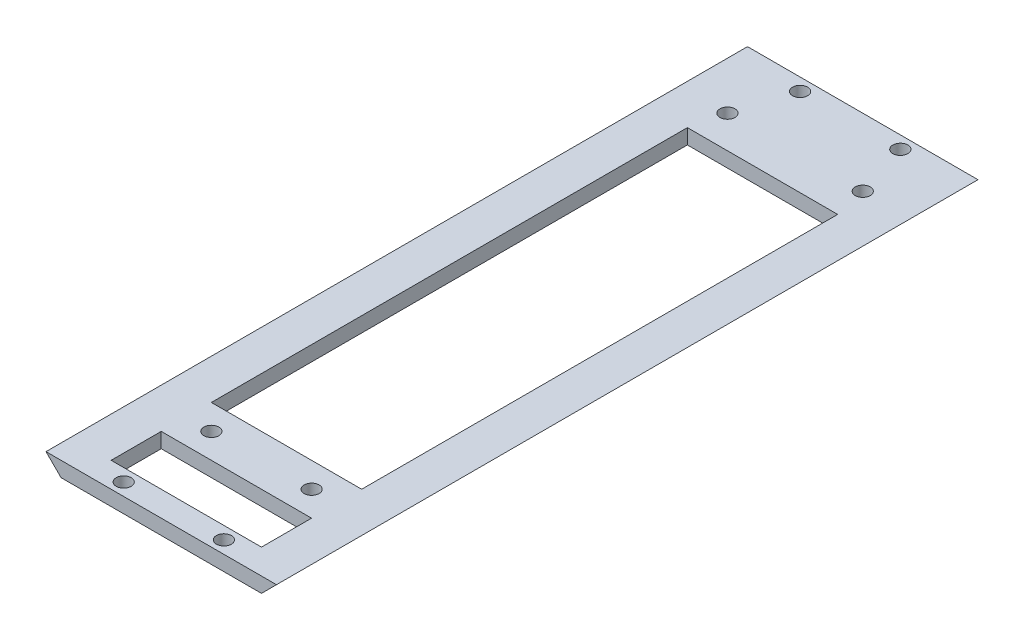
ISO-10303-21;
HEADER;
FILE_DESCRIPTION(('STEP AP214'),'2;1');
FILE_NAME('part.step','',(''),(''),'','','');
FILE_SCHEMA(('AUTOMOTIVE_DESIGN { 1 0 10303 214 1 1 1 1 }'));
ENDSEC;
DATA;
#1=APPLICATION_CONTEXT('core data for automotive mechanical design processes');
#2=APPLICATION_PROTOCOL_DEFINITION('international standard','automotive_design',2000,#1);
#3=PRODUCT_CONTEXT('',#1,'mechanical');
#4=PRODUCT('Part','Part','',(#3));
#5=PRODUCT_RELATED_PRODUCT_CATEGORY('part','',(#4));
#6=PRODUCT_DEFINITION_FORMATION('','',#4);
#7=PRODUCT_DEFINITION_CONTEXT('part definition',#1,'design');
#8=PRODUCT_DEFINITION('design','',#6,#7);
#9=PRODUCT_DEFINITION_SHAPE('','',#8);
#10=(LENGTH_UNIT() NAMED_UNIT(*) SI_UNIT(.MILLI.,.METRE.));
#11=(NAMED_UNIT(*) PLANE_ANGLE_UNIT() SI_UNIT($,.RADIAN.));
#12=(NAMED_UNIT(*) SI_UNIT($,.STERADIAN.) SOLID_ANGLE_UNIT());
#13=UNCERTAINTY_MEASURE_WITH_UNIT(LENGTH_MEASURE(1.E-05),#10,'distance_accuracy_value','');
#14=(GEOMETRIC_REPRESENTATION_CONTEXT(3) GLOBAL_UNCERTAINTY_ASSIGNED_CONTEXT((#13)) GLOBAL_UNIT_ASSIGNED_CONTEXT((#10,
#11,#12)) REPRESENTATION_CONTEXT('',''));
#15=CARTESIAN_POINT('',(0.,0.,0.));
#16=DIRECTION('',(0.,0.,1.));
#17=DIRECTION('',(1.,0.,0.));
#18=AXIS2_PLACEMENT_3D('',#15,#16,#17);
#19=CARTESIAN_POINT('',(0.,0.,0.));
#20=DIRECTION('',(0.,-1.,0.));
#21=DIRECTION('',(0.,0.,-1.));
#22=AXIS2_PLACEMENT_3D('',#19,#20,#21);
#23=PLANE('',#22);
#24=CARTESIAN_POINT('',(9.99999999999999,0.,67.5));
#25=DIRECTION('',(0.,1.,0.));
#26=DIRECTION('',(0.,0.,1.));
#27=AXIS2_PLACEMENT_3D('',#24,#25,#26);
#28=CIRCLE('',#27,1.5);
#29=CARTESIAN_POINT('',(9.99999999999999,0.,69.));
#30=VERTEX_POINT('',#29);
#31=EDGE_CURVE('E404',#30,#30,#28,.T.);
#32=ORIENTED_EDGE('',*,*,#31,.T.);
#33=EDGE_LOOP('',(#32));
#34=FACE_BOUND('',#33,.T.);
#35=CARTESIAN_POINT('',(-9.99999999999999,0.,-67.5));
#36=DIRECTION('',(0.,1.,0.));
#37=DIRECTION('',(0.,0.,1.));
#38=AXIS2_PLACEMENT_3D('',#35,#36,#37);
#39=CIRCLE('',#38,1.5);
#40=CARTESIAN_POINT('',(-9.99999999999999,0.,-66.));
#41=VERTEX_POINT('',#40);
#42=EDGE_CURVE('E192',#41,#41,#39,.T.);
#43=ORIENTED_EDGE('',*,*,#42,.T.);
#44=EDGE_LOOP('',(#43));
#45=FACE_BOUND('',#44,.T.);
#46=DIRECTION('',(1.,0.,0.));
#47=VECTOR('',#46,1.);
#48=CARTESIAN_POINT('',(0.,0.,55.));
#49=LINE('',#48,#47);
#50=CARTESIAN_POINT('',(-15.,0.,55.));
#51=VERTEX_POINT('',#50);
#52=CARTESIAN_POINT('',(15.,0.,55.));
#53=VERTEX_POINT('',#52);
#54=EDGE_CURVE('E205',#51,#53,#49,.T.);
#55=ORIENTED_EDGE('',*,*,#54,.F.);
#56=DIRECTION('',(0.,0.,-1.));
#57=VECTOR('',#56,1.);
#58=CARTESIAN_POINT('',(-15.,0.,-65.));
#59=LINE('',#58,#57);
#60=CARTESIAN_POINT('',(-15.,0.,65.));
#61=VERTEX_POINT('',#60);
#62=EDGE_CURVE('E155',#61,#51,#59,.T.);
#63=ORIENTED_EDGE('',*,*,#62,.F.);
#64=DIRECTION('',(-1.,0.,0.));
#65=VECTOR('',#64,1.);
#66=CARTESIAN_POINT('',(-15.,0.,65.));
#67=LINE('',#66,#65);
#68=CARTESIAN_POINT('',(15.,0.,65.));
#69=VERTEX_POINT('',#68);
#70=EDGE_CURVE('E245',#69,#61,#67,.T.);
#71=ORIENTED_EDGE('',*,*,#70,.F.);
#72=DIRECTION('',(0.,0.,1.));
#73=VECTOR('',#72,1.);
#74=CARTESIAN_POINT('',(15.,0.,-65.));
#75=LINE('',#74,#73);
#76=EDGE_CURVE('E242',#53,#69,#75,.T.);
#77=ORIENTED_EDGE('',*,*,#76,.F.);
#78=EDGE_LOOP('',(#55,#63,#71,#77));
#79=FACE_BOUND('',#78,.T.);
#80=CARTESIAN_POINT('',(15.,0.,-50.));
#81=VERTEX_POINT('',#80);
#82=CARTESIAN_POINT('',(15.,0.,45.));
#83=VERTEX_POINT('',#82);
#84=EDGE_CURVE('E68',#81,#83,#75,.T.);
#85=ORIENTED_EDGE('',*,*,#84,.F.);
#86=DIRECTION('',(-1.,0.,0.));
#87=VECTOR('',#86,1.);
#88=CARTESIAN_POINT('',(-20.,0.,-50.));
#89=LINE('',#88,#87);
#90=CARTESIAN_POINT('',(-15.,0.,-50.));
#91=VERTEX_POINT('',#90);
#92=EDGE_CURVE('E230',#81,#91,#89,.T.);
#93=ORIENTED_EDGE('',*,*,#92,.T.);
#94=CARTESIAN_POINT('',(-15.,0.,45.));
#95=VERTEX_POINT('',#94);
#96=EDGE_CURVE('E249',#95,#91,#59,.T.);
#97=ORIENTED_EDGE('',*,*,#96,.F.);
#98=DIRECTION('',(1.,0.,0.));
#99=VECTOR('',#98,1.);
#100=CARTESIAN_POINT('',(0.,0.,45.));
#101=LINE('',#100,#99);
#102=EDGE_CURVE('E202',#95,#83,#101,.T.);
#103=ORIENTED_EDGE('',*,*,#102,.T.);
#104=EDGE_LOOP('',(#85,#93,#97,#103));
#105=FACE_BOUND('',#104,.T.);
#106=DIRECTION('',(-1.,0.,0.));
#107=VECTOR('',#106,1.);
#108=CARTESIAN_POINT('',(-25.,0.,-70.));
#109=LINE('',#108,#107);
#110=CARTESIAN_POINT('',(20.,0.,-70.));
#111=VERTEX_POINT('',#110);
#112=CARTESIAN_POINT('',(-20.,0.,-70.));
#113=VERTEX_POINT('',#112);
#114=EDGE_CURVE('E284',#111,#113,#109,.T.);
#115=ORIENTED_EDGE('',*,*,#114,.F.);
#116=DIRECTION('',(0.,0.,-1.));
#117=VECTOR('',#116,1.);
#118=CARTESIAN_POINT('',(20.,0.,0.));
#119=LINE('',#118,#117);
#120=CARTESIAN_POINT('',(20.,0.,70.));
#121=VERTEX_POINT('',#120);
#122=EDGE_CURVE('E292',#121,#111,#119,.T.);
#123=ORIENTED_EDGE('',*,*,#122,.F.);
#124=DIRECTION('',(1.,0.,0.));
#125=VECTOR('',#124,1.);
#126=CARTESIAN_POINT('',(-25.,0.,70.));
#127=LINE('',#126,#125);
#128=CARTESIAN_POINT('',(-20.,0.,70.));
#129=VERTEX_POINT('',#128);
#130=EDGE_CURVE('E288',#129,#121,#127,.T.);
#131=ORIENTED_EDGE('',*,*,#130,.F.);
#132=DIRECTION('',(0.,0.,-1.));
#133=VECTOR('',#132,1.);
#134=CARTESIAN_POINT('',(-20.,0.,0.));
#135=LINE('',#134,#133);
#136=EDGE_CURVE('E295',#129,#113,#135,.T.);
#137=ORIENTED_EDGE('',*,*,#136,.T.);
#138=EDGE_LOOP('',(#115,#123,#131,#137));
#139=FACE_BOUND('',#138,.T.);
#140=CARTESIAN_POINT('',(13.5,0.,-56.5));
#141=DIRECTION('',(0.,-1.,0.));
#142=DIRECTION('',(0.,0.,1.));
#143=AXIS2_PLACEMENT_3D('',#140,#141,#142);
#144=CIRCLE('',#143,1.5);
#145=CARTESIAN_POINT('',(13.5,0.,-55.));
#146=VERTEX_POINT('',#145);
#147=EDGE_CURVE('E157',#146,#146,#144,.T.);
#148=ORIENTED_EDGE('',*,*,#147,.F.);
#149=EDGE_LOOP('',(#148));
#150=FACE_BOUND('',#149,.T.);
#151=CARTESIAN_POINT('',(-13.5,0.,-56.5));
#152=DIRECTION('',(0.,-1.,0.));
#153=DIRECTION('',(0.,0.,-1.));
#154=AXIS2_PLACEMENT_3D('',#151,#152,#153);
#155=CIRCLE('',#154,1.5);
#156=CARTESIAN_POINT('',(-13.5,0.,-58.));
#157=VERTEX_POINT('',#156);
#158=EDGE_CURVE('E222',#157,#157,#155,.T.);
#159=ORIENTED_EDGE('',*,*,#158,.F.);
#160=EDGE_LOOP('',(#159));
#161=FACE_BOUND('',#160,.T.);
#162=CARTESIAN_POINT('',(-9.99999999999999,0.,50.));
#163=DIRECTION('',(0.,-1.,0.));
#164=DIRECTION('',(0.,0.,-1.));
#165=AXIS2_PLACEMENT_3D('',#162,#163,#164);
#166=CIRCLE('',#165,1.5);
#167=CARTESIAN_POINT('',(-9.99999999999999,0.,48.5));
#168=VERTEX_POINT('',#167);
#169=EDGE_CURVE('E189',#168,#168,#166,.T.);
#170=ORIENTED_EDGE('',*,*,#169,.F.);
#171=EDGE_LOOP('',(#170));
#172=FACE_BOUND('',#171,.T.);
#173=CARTESIAN_POINT('',(10.,0.,50.0000000000001));
#174=DIRECTION('',(0.,-1.,0.));
#175=DIRECTION('',(0.,0.,-1.));
#176=AXIS2_PLACEMENT_3D('',#173,#174,#175);
#177=CIRCLE('',#176,1.5);
#178=CARTESIAN_POINT('',(10.,0.,48.5000000000001));
#179=VERTEX_POINT('',#178);
#180=EDGE_CURVE('E185',#179,#179,#177,.F.);
#181=ORIENTED_EDGE('',*,*,#180,.T.);
#182=EDGE_LOOP('',(#181));
#183=FACE_BOUND('',#182,.T.);
#184=CARTESIAN_POINT('',(9.99999999999999,0.,-67.5));
#185=DIRECTION('',(0.,-1.,0.));
#186=DIRECTION('',(0.,0.,-1.));
#187=AXIS2_PLACEMENT_3D('',#184,#185,#186);
#188=CIRCLE('',#187,1.5);
#189=CARTESIAN_POINT('',(9.99999999999999,0.,-69.));
#190=VERTEX_POINT('',#189);
#191=EDGE_CURVE('E397',#190,#190,#188,.T.);
#192=ORIENTED_EDGE('',*,*,#191,.F.);
#193=EDGE_LOOP('',(#192));
#194=FACE_BOUND('',#193,.T.);
#195=CARTESIAN_POINT('',(-9.99999999999999,0.,67.5));
#196=DIRECTION('',(0.,-1.,0.));
#197=DIRECTION('',(0.,0.,-1.));
#198=AXIS2_PLACEMENT_3D('',#195,#196,#197);
#199=CIRCLE('',#198,1.5);
#200=CARTESIAN_POINT('',(-9.99999999999999,0.,66.));
#201=VERTEX_POINT('',#200);
#202=EDGE_CURVE('E413',#201,#201,#199,.T.);
#203=ORIENTED_EDGE('',*,*,#202,.F.);
#204=EDGE_LOOP('',(#203));
#205=FACE_BOUND('',#204,.T.);
#206=ADVANCED_FACE('F44',(#34,#45,#79,#105,#139,#150,#161,#172,#183,#194,#205),#23,.T.);
#207=CARTESIAN_POINT('',(25.,3.,127.));
#208=DIRECTION('',(0.,-1.,0.));
#209=DIRECTION('',(0.,0.,-1.));
#210=AXIS2_PLACEMENT_3D('',#207,#208,#209);
#211=PLANE('',#210);
#212=CARTESIAN_POINT('',(9.99999999999999,3.,-67.5));
#213=DIRECTION('',(0.,-1.,0.));
#214=DIRECTION('',(0.,0.,-1.));
#215=AXIS2_PLACEMENT_3D('',#212,#213,#214);
#216=CIRCLE('',#215,1.5);
#217=CARTESIAN_POINT('',(9.99999999999999,3.,-69.));
#218=VERTEX_POINT('',#217);
#219=EDGE_CURVE('E394',#218,#218,#216,.T.);
#220=ORIENTED_EDGE('',*,*,#219,.T.);
#221=EDGE_LOOP('',(#220));
#222=FACE_BOUND('',#221,.T.);
#223=CARTESIAN_POINT('',(-9.99999999999999,3.,-67.5));
#224=DIRECTION('',(0.,1.,0.));
#225=DIRECTION('',(0.,0.,1.));
#226=AXIS2_PLACEMENT_3D('',#223,#224,#225);
#227=CIRCLE('',#226,1.5);
#228=CARTESIAN_POINT('',(-9.99999999999999,3.,-66.));
#229=VERTEX_POINT('',#228);
#230=EDGE_CURVE('E206',#229,#229,#227,.T.);
#231=ORIENTED_EDGE('',*,*,#230,.F.);
#232=EDGE_LOOP('',(#231));
#233=FACE_BOUND('',#232,.T.);
#234=DIRECTION('',(0.,0.,-1.));
#235=VECTOR('',#234,1.);
#236=CARTESIAN_POINT('',(-15.,3.,127.));
#237=LINE('',#236,#235);
#238=CARTESIAN_POINT('',(-15.,3.,65.));
#239=VERTEX_POINT('',#238);
#240=CARTESIAN_POINT('',(-15.,3.,55.));
#241=VERTEX_POINT('',#240);
#242=EDGE_CURVE('E152',#239,#241,#237,.T.);
#243=ORIENTED_EDGE('',*,*,#242,.T.);
#244=DIRECTION('',(1.,0.,0.));
#245=VECTOR('',#244,1.);
#246=CARTESIAN_POINT('',(0.,3.,55.));
#247=LINE('',#246,#245);
#248=CARTESIAN_POINT('',(15.,3.,55.));
#249=VERTEX_POINT('',#248);
#250=EDGE_CURVE('E136',#241,#249,#247,.T.);
#251=ORIENTED_EDGE('',*,*,#250,.T.);
#252=DIRECTION('',(0.,0.,1.));
#253=VECTOR('',#252,1.);
#254=CARTESIAN_POINT('',(15.,3.,127.));
#255=LINE('',#254,#253);
#256=CARTESIAN_POINT('',(15.,3.,65.));
#257=VERTEX_POINT('',#256);
#258=EDGE_CURVE('E164',#249,#257,#255,.T.);
#259=ORIENTED_EDGE('',*,*,#258,.T.);
#260=DIRECTION('',(-1.,0.,0.));
#261=VECTOR('',#260,1.);
#262=CARTESIAN_POINT('',(25.,3.,65.));
#263=LINE('',#262,#261);
#264=EDGE_CURVE('E162',#257,#239,#263,.T.);
#265=ORIENTED_EDGE('',*,*,#264,.T.);
#266=EDGE_LOOP('',(#243,#251,#259,#265));
#267=FACE_BOUND('',#266,.T.);
#268=DIRECTION('',(-1.,0.,0.));
#269=VECTOR('',#268,1.);
#270=CARTESIAN_POINT('',(25.,3.,-70.));
#271=LINE('',#270,#269);
#272=CARTESIAN_POINT('',(23.,3.,-70.));
#273=VERTEX_POINT('',#272);
#274=CARTESIAN_POINT('',(-23.,3.,-70.));
#275=VERTEX_POINT('',#274);
#276=EDGE_CURVE('E256',#273,#275,#271,.T.);
#277=ORIENTED_EDGE('',*,*,#276,.T.);
#278=DIRECTION('',(0.,0.,1.));
#279=VECTOR('',#278,1.);
#280=CARTESIAN_POINT('',(-23.,3.,-82.0000000000001));
#281=LINE('',#280,#279);
#282=CARTESIAN_POINT('',(-23.,3.,70.));
#283=VERTEX_POINT('',#282);
#284=EDGE_CURVE('E297',#275,#283,#281,.T.);
#285=ORIENTED_EDGE('',*,*,#284,.T.);
#286=DIRECTION('',(-1.,0.,0.));
#287=VECTOR('',#286,1.);
#288=CARTESIAN_POINT('',(-25.,3.,70.));
#289=LINE('',#288,#287);
#290=CARTESIAN_POINT('',(23.,3.,70.));
#291=VERTEX_POINT('',#290);
#292=EDGE_CURVE('E262',#291,#283,#289,.T.);
#293=ORIENTED_EDGE('',*,*,#292,.F.);
#294=DIRECTION('',(0.,0.,1.));
#295=VECTOR('',#294,1.);
#296=CARTESIAN_POINT('',(23.,3.,-82.0000000000001));
#297=LINE('',#296,#295);
#298=EDGE_CURVE('E266',#273,#291,#297,.T.);
#299=ORIENTED_EDGE('',*,*,#298,.F.);
#300=EDGE_LOOP('',(#277,#285,#293,#299));
#301=FACE_BOUND('',#300,.T.);
#302=DIRECTION('',(-1.,0.,0.));
#303=VECTOR('',#302,1.);
#304=CARTESIAN_POINT('',(-20.,3.,-50.));
#305=LINE('',#304,#303);
#306=CARTESIAN_POINT('',(15.,3.,-50.));
#307=VERTEX_POINT('',#306);
#308=CARTESIAN_POINT('',(-15.,3.,-50.));
#309=VERTEX_POINT('',#308);
#310=EDGE_CURVE('E175',#307,#309,#305,.T.);
#311=ORIENTED_EDGE('',*,*,#310,.F.);
#312=CARTESIAN_POINT('',(15.,3.,45.));
#313=VERTEX_POINT('',#312);
#314=EDGE_CURVE('E53',#307,#313,#255,.T.);
#315=ORIENTED_EDGE('',*,*,#314,.T.);
#316=DIRECTION('',(1.,0.,0.));
#317=VECTOR('',#316,1.);
#318=CARTESIAN_POINT('',(0.,3.,45.));
#319=LINE('',#318,#317);
#320=CARTESIAN_POINT('',(-15.,3.,45.));
#321=VERTEX_POINT('',#320);
#322=EDGE_CURVE('E60',#321,#313,#319,.T.);
#323=ORIENTED_EDGE('',*,*,#322,.F.);
#324=EDGE_CURVE('E165',#321,#309,#237,.T.);
#325=ORIENTED_EDGE('',*,*,#324,.T.);
#326=EDGE_LOOP('',(#311,#315,#323,#325));
#327=FACE_BOUND('',#326,.T.);
#328=CARTESIAN_POINT('',(13.5,3.,-56.5));
#329=DIRECTION('',(0.,-1.,0.));
#330=DIRECTION('',(0.,0.,1.));
#331=AXIS2_PLACEMENT_3D('',#328,#329,#330);
#332=CIRCLE('',#331,1.5);
#333=CARTESIAN_POINT('',(13.5,3.,-55.));
#334=VERTEX_POINT('',#333);
#335=EDGE_CURVE('E218',#334,#334,#332,.T.);
#336=ORIENTED_EDGE('',*,*,#335,.T.);
#337=EDGE_LOOP('',(#336));
#338=FACE_BOUND('',#337,.T.);
#339=CARTESIAN_POINT('',(-13.5,3.,-56.5));
#340=DIRECTION('',(0.,-1.,0.));
#341=DIRECTION('',(0.,0.,-1.));
#342=AXIS2_PLACEMENT_3D('',#339,#340,#341);
#343=CIRCLE('',#342,1.5);
#344=CARTESIAN_POINT('',(-13.5,3.,-58.));
#345=VERTEX_POINT('',#344);
#346=EDGE_CURVE('E226',#345,#345,#343,.T.);
#347=ORIENTED_EDGE('',*,*,#346,.T.);
#348=EDGE_LOOP('',(#347));
#349=FACE_BOUND('',#348,.T.);
#350=CARTESIAN_POINT('',(-9.99999999999999,3.,50.));
#351=DIRECTION('',(0.,-1.,0.));
#352=DIRECTION('',(0.,0.,-1.));
#353=AXIS2_PLACEMENT_3D('',#350,#351,#352);
#354=CIRCLE('',#353,1.5);
#355=CARTESIAN_POINT('',(-9.99999999999999,3.,48.5));
#356=VERTEX_POINT('',#355);
#357=EDGE_CURVE('E147',#356,#356,#354,.T.);
#358=ORIENTED_EDGE('',*,*,#357,.T.);
#359=EDGE_LOOP('',(#358));
#360=FACE_BOUND('',#359,.T.);
#361=CARTESIAN_POINT('',(10.,3.,50.0000000000001));
#362=DIRECTION('',(0.,-1.,0.));
#363=DIRECTION('',(0.,0.,-1.));
#364=AXIS2_PLACEMENT_3D('',#361,#362,#363);
#365=CIRCLE('',#364,1.5);
#366=CARTESIAN_POINT('',(10.,3.,48.5000000000001));
#367=VERTEX_POINT('',#366);
#368=EDGE_CURVE('E198',#367,#367,#365,.F.);
#369=ORIENTED_EDGE('',*,*,#368,.F.);
#370=EDGE_LOOP('',(#369));
#371=FACE_BOUND('',#370,.T.);
#372=CARTESIAN_POINT('',(9.99999999999999,3.,67.5));
#373=DIRECTION('',(0.,1.,0.));
#374=DIRECTION('',(0.,0.,1.));
#375=AXIS2_PLACEMENT_3D('',#372,#373,#374);
#376=CIRCLE('',#375,1.5);
#377=CARTESIAN_POINT('',(9.99999999999999,3.,69.));
#378=VERTEX_POINT('',#377);
#379=EDGE_CURVE('E409',#378,#378,#376,.T.);
#380=ORIENTED_EDGE('',*,*,#379,.F.);
#381=EDGE_LOOP('',(#380));
#382=FACE_BOUND('',#381,.T.);
#383=CARTESIAN_POINT('',(-9.99999999999999,3.,67.5));
#384=DIRECTION('',(0.,-1.,0.));
#385=DIRECTION('',(0.,0.,-1.));
#386=AXIS2_PLACEMENT_3D('',#383,#384,#385);
#387=CIRCLE('',#386,1.5);
#388=CARTESIAN_POINT('',(-9.99999999999999,3.,66.));
#389=VERTEX_POINT('',#388);
#390=EDGE_CURVE('E417',#389,#389,#387,.T.);
#391=ORIENTED_EDGE('',*,*,#390,.T.);
#392=EDGE_LOOP('',(#391));
#393=FACE_BOUND('',#392,.T.);
#394=ADVANCED_FACE('F159',(#222,#233,#267,#301,#327,#338,#349,#360,#371,#382,#393),#211,.F.);
#395=CARTESIAN_POINT('',(-15.,197.,-65.));
#396=DIRECTION('',(-1.,0.,0.));
#397=DIRECTION('',(0.,0.,1.));
#398=AXIS2_PLACEMENT_3D('',#395,#396,#397);
#399=PLANE('',#398);
#400=DIRECTION('',(0.,-1.,0.));
#401=VECTOR('',#400,1.);
#402=CARTESIAN_POINT('',(-15.,3.,55.));
#403=LINE('',#402,#401);
#404=EDGE_CURVE('E140',#241,#51,#403,.T.);
#405=ORIENTED_EDGE('',*,*,#404,.F.);
#406=ORIENTED_EDGE('',*,*,#242,.F.);
#407=DIRECTION('',(0.,-1.,0.));
#408=VECTOR('',#407,1.);
#409=CARTESIAN_POINT('',(-15.,197.,65.));
#410=LINE('',#409,#408);
#411=EDGE_CURVE('E253',#239,#61,#410,.T.);
#412=ORIENTED_EDGE('',*,*,#411,.T.);
#413=ORIENTED_EDGE('',*,*,#62,.T.);
#414=EDGE_LOOP('',(#405,#406,#412,#413));
#415=FACE_BOUND('',#414,.T.);
#416=ADVANCED_FACE('F151',(#415),#399,.F.);
#417=CARTESIAN_POINT('',(15.,197.,-65.));
#418=DIRECTION('',(1.,0.,0.));
#419=DIRECTION('',(0.,0.,-1.));
#420=AXIS2_PLACEMENT_3D('',#417,#418,#419);
#421=PLANE('',#420);
#422=DIRECTION('',(0.,-1.,0.));
#423=VECTOR('',#422,1.);
#424=CARTESIAN_POINT('',(15.,3.,55.));
#425=LINE('',#424,#423);
#426=EDGE_CURVE('E143',#249,#53,#425,.T.);
#427=ORIENTED_EDGE('',*,*,#426,.T.);
#428=ORIENTED_EDGE('',*,*,#76,.T.);
#429=DIRECTION('',(0.,-1.,0.));
#430=VECTOR('',#429,1.);
#431=CARTESIAN_POINT('',(15.,197.,65.));
#432=LINE('',#431,#430);
#433=EDGE_CURVE('E252',#257,#69,#432,.T.);
#434=ORIENTED_EDGE('',*,*,#433,.F.);
#435=ORIENTED_EDGE('',*,*,#258,.F.);
#436=EDGE_LOOP('',(#427,#428,#434,#435));
#437=FACE_BOUND('',#436,.T.);
#438=ADVANCED_FACE('F327',(#437),#421,.F.);
#439=ORIENTED_EDGE('',*,*,#324,.F.);
#440=DIRECTION('',(0.,-1.,0.));
#441=VECTOR('',#440,1.);
#442=CARTESIAN_POINT('',(-15.,3.,45.));
#443=LINE('',#442,#441);
#444=EDGE_CURVE('E182',#321,#95,#443,.T.);
#445=ORIENTED_EDGE('',*,*,#444,.T.);
#446=ORIENTED_EDGE('',*,*,#96,.T.);
#447=DIRECTION('',(0.,1.,0.));
#448=VECTOR('',#447,1.);
#449=CARTESIAN_POINT('',(-15.,197.,-50.));
#450=LINE('',#449,#448);
#451=EDGE_CURVE('E11',#91,#309,#450,.T.);
#452=ORIENTED_EDGE('',*,*,#451,.T.);
#453=EDGE_LOOP('',(#439,#445,#446,#452));
#454=FACE_BOUND('',#453,.T.);
#455=ADVANCED_FACE('F320',(#454),#399,.F.);
#456=CARTESIAN_POINT('',(-25.,5.,-70.));
#457=DIRECTION('',(0.,0.,1.));
#458=DIRECTION('',(1.,0.,0.));
#459=AXIS2_PLACEMENT_3D('',#456,#457,#458);
#460=PLANE('',#459);
#461=DIRECTION('',(-0.707106781186548,-0.707106781186548,0.));
#462=VECTOR('',#461,1.);
#463=CARTESIAN_POINT('',(0.,-20.,-70.));
#464=LINE('',#463,#462);
#465=EDGE_CURVE('E274',#273,#111,#464,.T.);
#466=ORIENTED_EDGE('',*,*,#465,.T.);
#467=ORIENTED_EDGE('',*,*,#114,.T.);
#468=DIRECTION('',(0.707106781186548,-0.707106781186548,0.));
#469=VECTOR('',#468,1.);
#470=CARTESIAN_POINT('',(-25.,5.,-70.));
#471=LINE('',#470,#469);
#472=EDGE_CURVE('E280',#275,#113,#471,.T.);
#473=ORIENTED_EDGE('',*,*,#472,.F.);
#474=ORIENTED_EDGE('',*,*,#276,.F.);
#475=EDGE_LOOP('',(#466,#467,#473,#474));
#476=FACE_BOUND('',#475,.T.);
#477=ADVANCED_FACE('F46',(#476),#460,.F.);
#478=CARTESIAN_POINT('',(-25.,5.,70.));
#479=DIRECTION('',(0.,0.,-1.));
#480=DIRECTION('',(-1.,0.,0.));
#481=AXIS2_PLACEMENT_3D('',#478,#479,#480);
#482=PLANE('',#481);
#483=DIRECTION('',(-0.707106781186548,-0.707106781186548,0.));
#484=VECTOR('',#483,1.);
#485=CARTESIAN_POINT('',(10.,-10.,70.));
#486=LINE('',#485,#484);
#487=EDGE_CURVE('E270',#291,#121,#486,.T.);
#488=ORIENTED_EDGE('',*,*,#487,.F.);
#489=ORIENTED_EDGE('',*,*,#292,.T.);
#490=DIRECTION('',(0.707106781186548,-0.707106781186548,0.));
#491=VECTOR('',#490,1.);
#492=CARTESIAN_POINT('',(-10.,-10.,70.));
#493=LINE('',#492,#491);
#494=EDGE_CURVE('E271',#283,#129,#493,.T.);
#495=ORIENTED_EDGE('',*,*,#494,.T.);
#496=ORIENTED_EDGE('',*,*,#130,.T.);
#497=EDGE_LOOP('',(#488,#489,#495,#496));
#498=FACE_BOUND('',#497,.T.);
#499=ADVANCED_FACE('F307',(#498),#482,.F.);
#500=CARTESIAN_POINT('',(10.,-10.,-82.0000000000001));
#501=DIRECTION('',(-0.707106781186548,0.707106781186548,0.));
#502=DIRECTION('',(-0.707106781186548,-0.707106781186548,0.));
#503=AXIS2_PLACEMENT_3D('',#500,#501,#502);
#504=PLANE('',#503);
#505=ORIENTED_EDGE('',*,*,#465,.F.);
#506=ORIENTED_EDGE('',*,*,#298,.T.);
#507=ORIENTED_EDGE('',*,*,#487,.T.);
#508=ORIENTED_EDGE('',*,*,#122,.T.);
#509=EDGE_LOOP('',(#505,#506,#507,#508));
#510=FACE_BOUND('',#509,.T.);
#511=ADVANCED_FACE('F317',(#510),#504,.F.);
#512=CARTESIAN_POINT('',(-10.,-10.,-82.0000000000001));
#513=DIRECTION('',(-0.707106781186548,-0.707106781186548,0.));
#514=DIRECTION('',(0.707106781186548,-0.707106781186548,0.));
#515=AXIS2_PLACEMENT_3D('',#512,#513,#514);
#516=PLANE('',#515);
#517=ORIENTED_EDGE('',*,*,#284,.F.);
#518=ORIENTED_EDGE('',*,*,#472,.T.);
#519=ORIENTED_EDGE('',*,*,#136,.F.);
#520=ORIENTED_EDGE('',*,*,#494,.F.);
#521=EDGE_LOOP('',(#517,#518,#519,#520));
#522=FACE_BOUND('',#521,.T.);
#523=ADVANCED_FACE('F309',(#522),#516,.T.);
#524=ORIENTED_EDGE('',*,*,#84,.T.);
#525=DIRECTION('',(0.,-1.,0.));
#526=VECTOR('',#525,1.);
#527=CARTESIAN_POINT('',(15.,3.,45.));
#528=LINE('',#527,#526);
#529=EDGE_CURVE('E179',#313,#83,#528,.T.);
#530=ORIENTED_EDGE('',*,*,#529,.F.);
#531=ORIENTED_EDGE('',*,*,#314,.F.);
#532=DIRECTION('',(0.,-1.,0.));
#533=VECTOR('',#532,1.);
#534=CARTESIAN_POINT('',(15.,197.,-50.));
#535=LINE('',#534,#533);
#536=EDGE_CURVE('E236',#307,#81,#535,.T.);
#537=ORIENTED_EDGE('',*,*,#536,.T.);
#538=EDGE_LOOP('',(#524,#530,#531,#537));
#539=FACE_BOUND('',#538,.T.);
#540=ADVANCED_FACE('F344',(#539),#421,.F.);
#541=CARTESIAN_POINT('',(-15.,197.,65.));
#542=DIRECTION('',(0.,0.,1.));
#543=DIRECTION('',(1.,0.,0.));
#544=AXIS2_PLACEMENT_3D('',#541,#542,#543);
#545=PLANE('',#544);
#546=ORIENTED_EDGE('',*,*,#433,.T.);
#547=ORIENTED_EDGE('',*,*,#70,.T.);
#548=ORIENTED_EDGE('',*,*,#411,.F.);
#549=ORIENTED_EDGE('',*,*,#264,.F.);
#550=EDGE_LOOP('',(#546,#547,#548,#549));
#551=FACE_BOUND('',#550,.T.);
#552=ADVANCED_FACE('F348',(#551),#545,.F.);
#553=CARTESIAN_POINT('',(-20.,3.,-50.));
#554=DIRECTION('',(0.,0.,1.));
#555=DIRECTION('',(1.,0.,0.));
#556=AXIS2_PLACEMENT_3D('',#553,#554,#555);
#557=PLANE('',#556);
#558=ORIENTED_EDGE('',*,*,#536,.F.);
#559=ORIENTED_EDGE('',*,*,#310,.T.);
#560=ORIENTED_EDGE('',*,*,#451,.F.);
#561=ORIENTED_EDGE('',*,*,#92,.F.);
#562=EDGE_LOOP('',(#558,#559,#560,#561));
#563=FACE_BOUND('',#562,.T.);
#564=ADVANCED_FACE('F349',(#563),#557,.T.);
#565=CARTESIAN_POINT('',(-13.5,3.,-56.5));
#566=DIRECTION('',(0.,-1.,0.));
#567=DIRECTION('',(0.,0.,-1.));
#568=AXIS2_PLACEMENT_3D('',#565,#566,#567);
#569=CYLINDRICAL_SURFACE('',#568,1.5);
#570=ORIENTED_EDGE('',*,*,#158,.T.);
#571=EDGE_LOOP('',(#570));
#572=FACE_BOUND('',#571,.T.);
#573=ORIENTED_EDGE('',*,*,#346,.F.);
#574=EDGE_LOOP('',(#573));
#575=FACE_BOUND('',#574,.T.);
#576=ADVANCED_FACE('F354',(#572,#575),#569,.F.);
#577=CARTESIAN_POINT('',(13.5,3.,-56.5));
#578=DIRECTION('',(0.,-1.,0.));
#579=DIRECTION('',(0.,0.,-1.));
#580=AXIS2_PLACEMENT_3D('',#577,#578,#579);
#581=CYLINDRICAL_SURFACE('',#580,1.5);
#582=ORIENTED_EDGE('',*,*,#147,.T.);
#583=EDGE_LOOP('',(#582));
#584=FACE_BOUND('',#583,.T.);
#585=ORIENTED_EDGE('',*,*,#335,.F.);
#586=EDGE_LOOP('',(#585));
#587=FACE_BOUND('',#586,.T.);
#588=ADVANCED_FACE('F358',(#584,#587),#581,.F.);
#589=CARTESIAN_POINT('',(0.,3.,55.));
#590=DIRECTION('',(0.,0.,-1.));
#591=DIRECTION('',(-1.,0.,0.));
#592=AXIS2_PLACEMENT_3D('',#589,#590,#591);
#593=PLANE('',#592);
#594=ORIENTED_EDGE('',*,*,#54,.T.);
#595=ORIENTED_EDGE('',*,*,#426,.F.);
#596=ORIENTED_EDGE('',*,*,#250,.F.);
#597=ORIENTED_EDGE('',*,*,#404,.T.);
#598=EDGE_LOOP('',(#594,#595,#596,#597));
#599=FACE_BOUND('',#598,.T.);
#600=ADVANCED_FACE('F139',(#599),#593,.F.);
#601=CARTESIAN_POINT('',(-9.99999999999999,3.,50.));
#602=DIRECTION('',(0.,-1.,0.));
#603=DIRECTION('',(0.,0.,-1.));
#604=AXIS2_PLACEMENT_3D('',#601,#602,#603);
#605=CYLINDRICAL_SURFACE('',#604,1.5);
#606=ORIENTED_EDGE('',*,*,#357,.F.);
#607=EDGE_LOOP('',(#606));
#608=FACE_BOUND('',#607,.T.);
#609=ORIENTED_EDGE('',*,*,#169,.T.);
#610=EDGE_LOOP('',(#609));
#611=FACE_BOUND('',#610,.T.);
#612=ADVANCED_FACE('F366',(#608,#611),#605,.F.);
#613=CARTESIAN_POINT('',(0.,3.,45.));
#614=DIRECTION('',(0.,0.,-1.));
#615=DIRECTION('',(-1.,0.,0.));
#616=AXIS2_PLACEMENT_3D('',#613,#614,#615);
#617=PLANE('',#616);
#618=ORIENTED_EDGE('',*,*,#102,.F.);
#619=ORIENTED_EDGE('',*,*,#444,.F.);
#620=ORIENTED_EDGE('',*,*,#322,.T.);
#621=ORIENTED_EDGE('',*,*,#529,.T.);
#622=EDGE_LOOP('',(#618,#619,#620,#621));
#623=FACE_BOUND('',#622,.T.);
#624=ADVANCED_FACE('F178',(#623),#617,.T.);
#625=CARTESIAN_POINT('',(10.,3.,50.0000000000001));
#626=DIRECTION('',(0.,-1.,0.));
#627=DIRECTION('',(0.,0.,-1.));
#628=AXIS2_PLACEMENT_3D('',#625,#626,#627);
#629=CYLINDRICAL_SURFACE('',#628,1.5);
#630=ORIENTED_EDGE('',*,*,#368,.T.);
#631=EDGE_LOOP('',(#630));
#632=FACE_BOUND('',#631,.T.);
#633=ORIENTED_EDGE('',*,*,#180,.F.);
#634=EDGE_LOOP('',(#633));
#635=FACE_BOUND('',#634,.T.);
#636=ADVANCED_FACE('F365',(#632,#635),#629,.F.);
#637=CARTESIAN_POINT('',(-9.99999999999999,3.,-67.5));
#638=DIRECTION('',(0.,-1.,0.));
#639=DIRECTION('',(0.,0.,-1.));
#640=AXIS2_PLACEMENT_3D('',#637,#638,#639);
#641=CYLINDRICAL_SURFACE('',#640,1.5);
#642=ORIENTED_EDGE('',*,*,#230,.T.);
#643=EDGE_LOOP('',(#642));
#644=FACE_BOUND('',#643,.T.);
#645=ORIENTED_EDGE('',*,*,#42,.F.);
#646=EDGE_LOOP('',(#645));
#647=FACE_BOUND('',#646,.T.);
#648=ADVANCED_FACE('F373',(#644,#647),#641,.F.);
#649=CARTESIAN_POINT('',(9.99999999999999,3.,-67.5));
#650=DIRECTION('',(0.,-1.,0.));
#651=DIRECTION('',(0.,0.,-1.));
#652=AXIS2_PLACEMENT_3D('',#649,#650,#651);
#653=CYLINDRICAL_SURFACE('',#652,1.5);
#654=ORIENTED_EDGE('',*,*,#219,.F.);
#655=EDGE_LOOP('',(#654));
#656=FACE_BOUND('',#655,.T.);
#657=ORIENTED_EDGE('',*,*,#191,.T.);
#658=EDGE_LOOP('',(#657));
#659=FACE_BOUND('',#658,.T.);
#660=ADVANCED_FACE('F377',(#656,#659),#653,.F.);
#661=CARTESIAN_POINT('',(9.99999999999999,3.,67.5));
#662=DIRECTION('',(0.,-1.,0.));
#663=DIRECTION('',(0.,0.,-1.));
#664=AXIS2_PLACEMENT_3D('',#661,#662,#663);
#665=CYLINDRICAL_SURFACE('',#664,1.5);
#666=ORIENTED_EDGE('',*,*,#379,.T.);
#667=EDGE_LOOP('',(#666));
#668=FACE_BOUND('',#667,.T.);
#669=ORIENTED_EDGE('',*,*,#31,.F.);
#670=EDGE_LOOP('',(#669));
#671=FACE_BOUND('',#670,.T.);
#672=ADVANCED_FACE('F382',(#668,#671),#665,.F.);
#673=CARTESIAN_POINT('',(-9.99999999999999,3.,67.5));
#674=DIRECTION('',(0.,-1.,0.));
#675=DIRECTION('',(0.,0.,-1.));
#676=AXIS2_PLACEMENT_3D('',#673,#674,#675);
#677=CYLINDRICAL_SURFACE('',#676,1.5);
#678=ORIENTED_EDGE('',*,*,#390,.F.);
#679=EDGE_LOOP('',(#678));
#680=FACE_BOUND('',#679,.T.);
#681=ORIENTED_EDGE('',*,*,#202,.T.);
#682=EDGE_LOOP('',(#681));
#683=FACE_BOUND('',#682,.T.);
#684=ADVANCED_FACE('F379',(#680,#683),#677,.F.);
#685=CLOSED_SHELL('',(#206,#394,#416,#438,#455,#477,#499,#511,#523,#540,#552,#564,#576,#588,
#600,#612,#624,#636,#648,#660,#672,#684));
#686=MANIFOLD_SOLID_BREP('B2',#685);
#687=ADVANCED_BREP_SHAPE_REPRESENTATION('',(#18,#686),#14);
#688=SHAPE_DEFINITION_REPRESENTATION(#9,#687);
ENDSEC;
END-ISO-10303-21;
